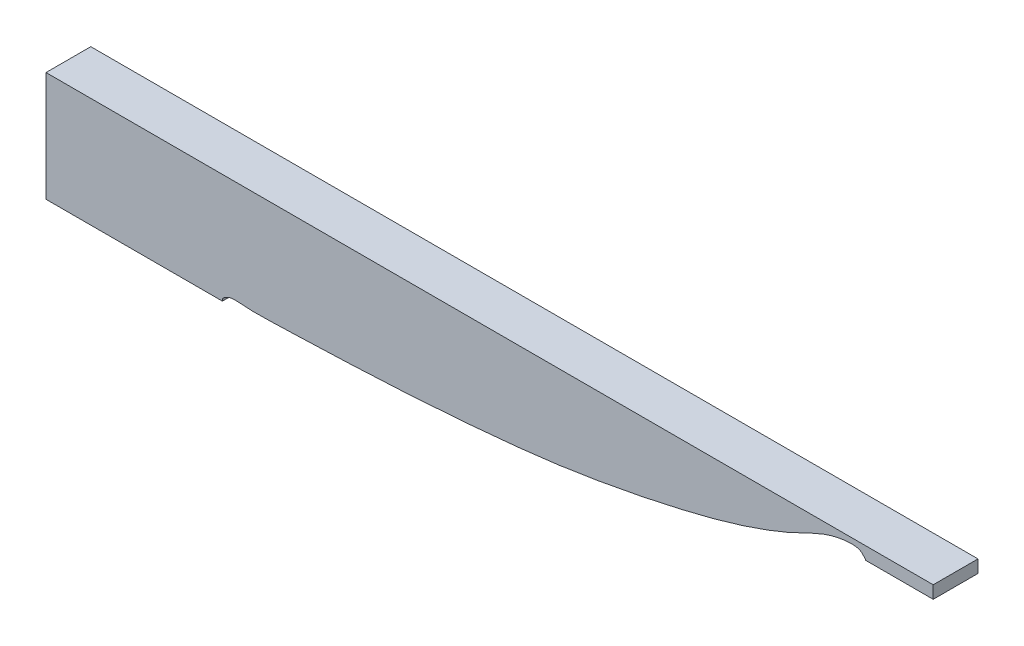
ISO-10303-21;
HEADER;
FILE_DESCRIPTION(('STEP AP214'),'2;1');
FILE_NAME('part.step','',(''),(''),'','','');
FILE_SCHEMA(('AUTOMOTIVE_DESIGN { 1 0 10303 214 1 1 1 1 }'));
ENDSEC;
DATA;
#1=APPLICATION_CONTEXT('core data for automotive mechanical design processes');
#2=APPLICATION_PROTOCOL_DEFINITION('international standard','automotive_design',2000,#1);
#3=PRODUCT_CONTEXT('',#1,'mechanical');
#4=PRODUCT('Part','Part','',(#3));
#5=PRODUCT_RELATED_PRODUCT_CATEGORY('part','',(#4));
#6=PRODUCT_DEFINITION_FORMATION('','',#4);
#7=PRODUCT_DEFINITION_CONTEXT('part definition',#1,'design');
#8=PRODUCT_DEFINITION('design','',#6,#7);
#9=PRODUCT_DEFINITION_SHAPE('','',#8);
#10=(LENGTH_UNIT() NAMED_UNIT(*) SI_UNIT(.MILLI.,.METRE.));
#11=(NAMED_UNIT(*) PLANE_ANGLE_UNIT() SI_UNIT($,.RADIAN.));
#12=(NAMED_UNIT(*) SI_UNIT($,.STERADIAN.) SOLID_ANGLE_UNIT());
#13=UNCERTAINTY_MEASURE_WITH_UNIT(LENGTH_MEASURE(1.E-05),#10,'distance_accuracy_value','');
#14=(GEOMETRIC_REPRESENTATION_CONTEXT(3) GLOBAL_UNCERTAINTY_ASSIGNED_CONTEXT((#13)) GLOBAL_UNIT_ASSIGNED_CONTEXT((#10,
#11,#12)) REPRESENTATION_CONTEXT('',''));
#15=CARTESIAN_POINT('',(0.,0.,0.));
#16=DIRECTION('',(0.,0.,1.));
#17=DIRECTION('',(1.,0.,0.));
#18=AXIS2_PLACEMENT_3D('',#15,#16,#17);
#19=CARTESIAN_POINT('',(-57.0856444779674,-17.3584070864247,420.));
#20=CARTESIAN_POINT('',(-57.0958938511895,-17.2812807740695,420.));
#21=CARTESIAN_POINT('',(-57.1046449984719,-17.2036665476292,420.));
#22=CARTESIAN_POINT('',(-57.0899645176034,-17.0492737578739,420.));
#23=CARTESIAN_POINT('',(-57.0668828076527,-16.9734881157553,420.));
#24=CARTESIAN_POINT('',(-56.9878355157819,-16.8378223846223,420.));
#25=CARTESIAN_POINT('',(-56.9316112455652,-16.7831693763308,420.));
#26=CARTESIAN_POINT('',(-56.8080894899606,-16.6877198817174,420.));
#27=CARTESIAN_POINT('',(-56.7437683030261,-16.6434958151046,420.));
#28=CARTESIAN_POINT('',(-56.5516796164489,-16.5096274099825,420.));
#29=CARTESIAN_POINT('',(-56.4199949598256,-16.4264797119411,420.));
#30=CARTESIAN_POINT('',(-56.1448046291808,-16.2807479394498,420.));
#31=CARTESIAN_POINT('',(-55.9995997977835,-16.2206800897899,420.));
#32=CARTESIAN_POINT('',(-55.5579023322916,-16.091901408502,420.));
#33=CARTESIAN_POINT('',(-55.2501587200471,-16.0631446233928,420.));
#34=CARTESIAN_POINT('',(-54.6320985145757,-16.0495812138025,420.));
#35=CARTESIAN_POINT('',(-54.3239983710323,-16.063703374076,420.));
#36=CARTESIAN_POINT('',(-53.7084182226755,-16.1058873346026,420.));
#37=CARTESIAN_POINT('',(-53.4008641403254,-16.1339882003165,420.));
#38=CARTESIAN_POINT('',(-52.7855704081264,-16.177382805587,420.));
#39=CARTESIAN_POINT('',(-52.477992049539,-16.1934040094259,420.));
#40=CARTESIAN_POINT('',(-51.5554291724624,-16.2272003278678,420.));
#41=CARTESIAN_POINT('',(-50.9406291232356,-16.2296914870753,420.));
#42=CARTESIAN_POINT('',(-49.7113153436075,-16.2109512400088,420.));
#43=CARTESIAN_POINT('',(-49.0967641295459,-16.1928254925497,420.));
#44=CARTESIAN_POINT('',(-47.8676632328352,-16.1564471144936,420.));
#45=CARTESIAN_POINT('',(-47.2531077047007,-16.1386788038124,420.));
#46=CARTESIAN_POINT('',(-45.4094873855464,-16.0815406260742,420.));
#47=CARTESIAN_POINT('',(-44.1804606464768,-16.0383988732113,420.));
#48=CARTESIAN_POINT('',(-40.4934412801088,-15.9086189602691,420.));
#49=CARTESIAN_POINT('',(-38.0355300402966,-15.8189897272557,420.));
#50=CARTESIAN_POINT('',(-33.120300515922,-15.6248458989966,420.));
#51=CARTESIAN_POINT('',(-30.6630116675852,-15.5173604476547,420.));
#52=CARTESIAN_POINT('',(-25.7509362005327,-15.2649205038111,420.));
#53=CARTESIAN_POINT('',(-23.2961058982495,-15.1199275619522,420.));
#54=CARTESIAN_POINT('',(-18.3891450502226,-14.7879662459706,420.));
#55=CARTESIAN_POINT('',(-15.9369298305191,-14.602314370581,420.));
#56=CARTESIAN_POINT('',(-11.0346522059931,-14.1975389589726,420.));
#57=CARTESIAN_POINT('',(-8.58494258066309,-13.9796971209189,420.));
#58=CARTESIAN_POINT('',(-3.69151938891769,-13.4933574943147,420.));
#59=CARTESIAN_POINT('',(-1.24779688227064,-13.2236687991472,420.));
#60=CARTESIAN_POINT('',(3.6300234731844,-12.5989024675774,420.));
#61=CARTESIAN_POINT('',(6.0648283105922,-12.2422988816133,420.));
#62=CARTESIAN_POINT('',(10.9197419074105,-11.4429748096449,420.));
#63=CARTESIAN_POINT('',(13.3400043757498,-11.002235927512,420.));
#64=CARTESIAN_POINT('',(18.1699527866466,-10.0608096695689,420.));
#65=CARTESIAN_POINT('',(20.5782748669358,-9.55899324798193,420.));
#66=CARTESIAN_POINT('',(25.3786228586416,-8.47916452803047,420.));
#67=CARTESIAN_POINT('',(27.7713741101703,-7.90431392556251,420.));
#68=CARTESIAN_POINT('',(31.332523574618,-6.9578710546056,420.));
#69=CARTESIAN_POINT('',(32.5149972874331,-6.627653657545,420.));
#70=CARTESIAN_POINT('',(34.8679155496699,-5.92848135555881,420.));
#71=CARTESIAN_POINT('',(36.0381624199744,-5.55888986468718,420.));
#72=CARTESIAN_POINT('',(38.3663816823761,-4.78017938792675,420.));
#73=CARTESIAN_POINT('',(39.5246614401862,-4.37205021166372,420.));
#74=CARTESIAN_POINT('',(41.8253177295228,-3.50457870880546,420.));
#75=CARTESIAN_POINT('',(42.9684388269928,-3.04457568465993,420.));
#76=CARTESIAN_POINT('',(44.6616426983345,-2.29650040891828,420.));
#77=CARTESIAN_POINT('',(45.2221946304159,-2.03757586017944,420.));
#78=CARTESIAN_POINT('',(46.3391022117933,-1.5092984898531,420.));
#79=CARTESIAN_POINT('',(46.8949049029899,-1.23857150016736,420.));
#80=CARTESIAN_POINT('',(48.5649860938904,-0.433033552588563,420.));
#81=CARTESIAN_POINT('',(49.6832532873829,0.0918650163485286,420.));
#82=CARTESIAN_POINT('',(51.4372284369122,0.688916278049471,420.));
#83=CARTESIAN_POINT('',(52.0353604842366,0.854449671930844,420.));
#84=CARTESIAN_POINT('',(52.9538107497272,1.04993547585779,420.));
#85=CARTESIAN_POINT('',(53.2643885021679,1.1067063546377,420.));
#86=CARTESIAN_POINT('',(53.8859236690231,1.20015963243951,420.));
#87=CARTESIAN_POINT('',(54.1973152604482,1.2366869823558,420.));
#88=CARTESIAN_POINT('',(54.8214947366659,1.28691953949747,420.));
#89=CARTESIAN_POINT('',(55.1342449647782,1.30124023781418,420.));
#90=CARTESIAN_POINT('',(55.6055050500895,1.28782932508196,420.));
#91=CARTESIAN_POINT('',(55.7629417194518,1.27763875985676,420.));
#92=CARTESIAN_POINT('',(56.0786499595446,1.2436113294242,420.));
#93=CARTESIAN_POINT('',(56.2351864124384,1.21937160701378,420.));
#94=CARTESIAN_POINT('',(56.5417182706391,1.14511493952684,420.));
#95=CARTESIAN_POINT('',(56.6941753963643,1.09361862704683,420.));
#96=CARTESIAN_POINT('',(56.9754219988949,0.947737573456112,420.));
#97=CARTESIAN_POINT('',(57.1003287389096,0.851296687484915,420.));
#98=CARTESIAN_POINT('',(57.3318178126711,0.631893861296292,420.));
#99=CARTESIAN_POINT('',(57.4351452052687,0.511001626209628,420.));
#100=CARTESIAN_POINT('',(57.5957624664121,0.334733802734946,420.));
#101=CARTESIAN_POINT('',(57.6495778388689,0.276226860924751,420.));
#102=CARTESIAN_POINT('',(57.7457152479352,0.14885472804569,420.));
#103=CARTESIAN_POINT('',(57.7854178586045,0.0787515489840809,420.));
#104=CARTESIAN_POINT('',(57.8020920778847,0.,420.));
#105=B_SPLINE_CURVE_WITH_KNOTS('',3,(#19,#20,#21,#22,#23,#24,#25,#26,#27,#28,#29,#30,#31,#32,
#33,#34,#35,#36,#37,#38,#39,#40,#41,#42,#43,#44,#45,#46,#47,#48,#49,#50,#51,#52,#53,#54,#55,#56,
#57,#58,#59,#60,#61,#62,#63,#64,#65,#66,#67,#68,#69,#70,#71,#72,#73,#74,#75,#76,#77,#78,#79,#80,
#81,#82,#83,#84,#85,#86,#87,#88,#89,#90,#91,#92,#93,#94,#95,#96,#97,#98,#99,#100,#101,#102,#103,
#104),.UNSPECIFIED.,.F.,.F.,(4,2,2,2,2,2,2,2,2,2,2,2,2,2,2,2,2,2,2,2,2,2,2,2,2,2,2,2,2,2,2,2,2,
2,2,2,2,2,2,2,2,2,4),(0.,0.00195312499999989,0.00390624999999978,0.00585937499999978,
0.00781249999999967,0.0117187499999996,0.0156249999999996,0.0234374999999994,0.0312499999999993,
0.0390624999999992,0.0468749999999991,0.062499999999999,0.0781249999999989,0.0937499999999988,
0.124999999999999,0.187499999999999,0.249999999999999,0.312499999999999,0.374999999999999,
0.437499999999999,0.499999999999999,0.562499999999999,0.625,0.6875,0.75,0.78125,0.8125,0.84375,
0.875,0.890625,0.90625,0.9375,0.953125,0.9609375,0.96875,0.9765625,0.98046875,0.984375,
0.98828125,0.9921875,0.99609375,0.998046875,1.),.UNSPECIFIED.);
#106=DIRECTION('',(0.,0.,-1.));
#107=VECTOR('',#106,1.);
#108=SURFACE_OF_LINEAR_EXTRUSION('',#105,#107);
#109=CARTESIAN_POINT('',(-57.0856444779674,-17.3584070864247,412.));
#110=CARTESIAN_POINT('',(-57.0958938511895,-17.2812807740695,412.));
#111=CARTESIAN_POINT('',(-57.1046449984719,-17.2036665476292,412.));
#112=CARTESIAN_POINT('',(-57.0899645176034,-17.0492737578739,412.));
#113=CARTESIAN_POINT('',(-57.0668828076527,-16.9734881157553,412.));
#114=CARTESIAN_POINT('',(-56.9878355157819,-16.8378223846223,412.));
#115=CARTESIAN_POINT('',(-56.9316112455652,-16.7831693763308,412.));
#116=CARTESIAN_POINT('',(-56.8080894899606,-16.6877198817174,412.));
#117=CARTESIAN_POINT('',(-56.7437683030261,-16.6434958151046,412.));
#118=CARTESIAN_POINT('',(-56.5516796164489,-16.5096274099825,412.));
#119=CARTESIAN_POINT('',(-56.4199949598256,-16.4264797119411,412.));
#120=CARTESIAN_POINT('',(-56.1448046291808,-16.2807479394498,412.));
#121=CARTESIAN_POINT('',(-55.9995997977835,-16.2206800897899,412.));
#122=CARTESIAN_POINT('',(-55.5579023322916,-16.091901408502,412.));
#123=CARTESIAN_POINT('',(-55.2501587200471,-16.0631446233928,412.));
#124=CARTESIAN_POINT('',(-54.6320985145757,-16.0495812138025,412.));
#125=CARTESIAN_POINT('',(-54.3239983710323,-16.063703374076,412.));
#126=CARTESIAN_POINT('',(-53.7084182226755,-16.1058873346026,412.));
#127=CARTESIAN_POINT('',(-53.4008641403254,-16.1339882003165,412.));
#128=CARTESIAN_POINT('',(-52.7855704081264,-16.177382805587,412.));
#129=CARTESIAN_POINT('',(-52.477992049539,-16.1934040094259,412.));
#130=CARTESIAN_POINT('',(-51.5554291724624,-16.2272003278678,412.));
#131=CARTESIAN_POINT('',(-50.9406291232356,-16.2296914870753,412.));
#132=CARTESIAN_POINT('',(-49.7113153436075,-16.2109512400088,412.));
#133=CARTESIAN_POINT('',(-49.0967641295459,-16.1928254925497,412.));
#134=CARTESIAN_POINT('',(-47.8676632328352,-16.1564471144936,412.));
#135=CARTESIAN_POINT('',(-47.2531077047007,-16.1386788038124,412.));
#136=CARTESIAN_POINT('',(-45.4094873855464,-16.0815406260742,412.));
#137=CARTESIAN_POINT('',(-44.1804606464768,-16.0383988732113,412.));
#138=CARTESIAN_POINT('',(-40.4934412801088,-15.9086189602691,412.));
#139=CARTESIAN_POINT('',(-38.0355300402966,-15.8189897272557,412.));
#140=CARTESIAN_POINT('',(-33.120300515922,-15.6248458989966,412.));
#141=CARTESIAN_POINT('',(-30.6630116675852,-15.5173604476547,412.));
#142=CARTESIAN_POINT('',(-25.7509362005327,-15.2649205038111,412.));
#143=CARTESIAN_POINT('',(-23.2961058982495,-15.1199275619522,412.));
#144=CARTESIAN_POINT('',(-18.3891450502226,-14.7879662459706,412.));
#145=CARTESIAN_POINT('',(-15.9369298305191,-14.602314370581,412.));
#146=CARTESIAN_POINT('',(-11.0346522059931,-14.1975389589726,412.));
#147=CARTESIAN_POINT('',(-8.58494258066309,-13.9796971209189,412.));
#148=CARTESIAN_POINT('',(-3.69151938891769,-13.4933574943147,412.));
#149=CARTESIAN_POINT('',(-1.24779688227064,-13.2236687991472,412.));
#150=CARTESIAN_POINT('',(3.6300234731844,-12.5989024675774,412.));
#151=CARTESIAN_POINT('',(6.0648283105922,-12.2422988816133,412.));
#152=CARTESIAN_POINT('',(10.9197419074105,-11.4429748096449,412.));
#153=CARTESIAN_POINT('',(13.3400043757498,-11.002235927512,412.));
#154=CARTESIAN_POINT('',(18.1699527866466,-10.0608096695689,412.));
#155=CARTESIAN_POINT('',(20.5782748669358,-9.55899324798193,412.));
#156=CARTESIAN_POINT('',(25.3786228586416,-8.47916452803047,412.));
#157=CARTESIAN_POINT('',(27.7713741101703,-7.90431392556251,412.));
#158=CARTESIAN_POINT('',(31.332523574618,-6.9578710546056,412.));
#159=CARTESIAN_POINT('',(32.5149972874331,-6.627653657545,412.));
#160=CARTESIAN_POINT('',(34.8679155496699,-5.92848135555881,412.));
#161=CARTESIAN_POINT('',(36.0381624199744,-5.55888986468718,412.));
#162=CARTESIAN_POINT('',(38.3663816823761,-4.78017938792675,412.));
#163=CARTESIAN_POINT('',(39.5246614401862,-4.37205021166372,412.));
#164=CARTESIAN_POINT('',(41.8253177295228,-3.50457870880546,412.));
#165=CARTESIAN_POINT('',(42.9684388269928,-3.04457568465993,412.));
#166=CARTESIAN_POINT('',(44.6616426983345,-2.29650040891828,412.));
#167=CARTESIAN_POINT('',(45.2221946304159,-2.03757586017944,412.));
#168=CARTESIAN_POINT('',(46.3391022117933,-1.5092984898531,412.));
#169=CARTESIAN_POINT('',(46.8949049029899,-1.23857150016736,412.));
#170=CARTESIAN_POINT('',(48.5649860938904,-0.433033552588563,412.));
#171=CARTESIAN_POINT('',(49.6832532873829,0.0918650163485286,412.));
#172=CARTESIAN_POINT('',(51.4372284369122,0.688916278049471,412.));
#173=CARTESIAN_POINT('',(52.0353604842366,0.854449671930844,412.));
#174=CARTESIAN_POINT('',(52.9538107497272,1.04993547585779,412.));
#175=CARTESIAN_POINT('',(53.2643885021679,1.1067063546377,412.));
#176=CARTESIAN_POINT('',(53.8859236690231,1.20015963243951,412.));
#177=CARTESIAN_POINT('',(54.1973152604482,1.2366869823558,412.));
#178=CARTESIAN_POINT('',(54.8214947366659,1.28691953949747,412.));
#179=CARTESIAN_POINT('',(55.1342449647782,1.30124023781418,412.));
#180=CARTESIAN_POINT('',(55.6055050500895,1.28782932508196,412.));
#181=CARTESIAN_POINT('',(55.7629417194518,1.27763875985676,412.));
#182=CARTESIAN_POINT('',(56.0786499595446,1.2436113294242,412.));
#183=CARTESIAN_POINT('',(56.2351864124384,1.21937160701378,412.));
#184=CARTESIAN_POINT('',(56.5417182706391,1.14511493952684,412.));
#185=CARTESIAN_POINT('',(56.6941753963643,1.09361862704683,412.));
#186=CARTESIAN_POINT('',(56.9754219988949,0.947737573456112,412.));
#187=CARTESIAN_POINT('',(57.1003287389096,0.851296687484915,412.));
#188=CARTESIAN_POINT('',(57.3318178126711,0.631893861296292,412.));
#189=CARTESIAN_POINT('',(57.4351452052687,0.511001626209628,412.));
#190=CARTESIAN_POINT('',(57.5957624664121,0.334733802734946,412.));
#191=CARTESIAN_POINT('',(57.6495778388689,0.276226860924751,412.));
#192=CARTESIAN_POINT('',(57.7457152479352,0.14885472804569,412.));
#193=CARTESIAN_POINT('',(57.7854178586045,0.0787515489840809,412.));
#194=CARTESIAN_POINT('',(57.8020920778847,0.,412.));
#195=B_SPLINE_CURVE_WITH_KNOTS('',3,(#109,#110,#111,#112,#113,#114,#115,#116,#117,#118,#119,
#120,#121,#122,#123,#124,#125,#126,#127,#128,#129,#130,#131,#132,#133,#134,#135,#136,#137,#138,
#139,#140,#141,#142,#143,#144,#145,#146,#147,#148,#149,#150,#151,#152,#153,#154,#155,#156,#157,
#158,#159,#160,#161,#162,#163,#164,#165,#166,#167,#168,#169,#170,#171,#172,#173,#174,#175,#176,
#177,#178,#179,#180,#181,#182,#183,#184,#185,#186,#187,#188,#189,#190,#191,#192,#193,#194),
.UNSPECIFIED.,.F.,.F.,(4,2,2,2,2,2,2,2,2,2,2,2,2,2,2,2,2,2,2,2,2,2,2,2,2,2,2,2,2,2,2,2,2,2,2,2,
2,2,2,2,2,2,4),(0.,0.00195312499999989,0.00390624999999978,0.00585937499999978,
0.00781249999999967,0.0117187499999996,0.0156249999999996,0.0234374999999994,0.0312499999999993,
0.0390624999999992,0.0468749999999991,0.062499999999999,0.0781249999999989,0.0937499999999988,
0.124999999999999,0.187499999999999,0.249999999999999,0.312499999999999,0.374999999999999,
0.437499999999999,0.499999999999999,0.562499999999999,0.625,0.6875,0.75,0.78125,0.8125,0.84375,
0.875,0.890625,0.90625,0.9375,0.953125,0.9609375,0.96875,0.9765625,0.98046875,0.984375,
0.98828125,0.9921875,0.99609375,0.998046875,1.),.UNSPECIFIED.);
#196=CARTESIAN_POINT('',(-57.0856444779674,-17.3584070864247,412.));
#197=VERTEX_POINT('',#196);
#198=CARTESIAN_POINT('',(57.8020920778847,0.,412.));
#199=VERTEX_POINT('',#198);
#200=EDGE_CURVE('E165',#197,#199,#195,.T.);
#201=ORIENTED_EDGE('',*,*,#200,.T.);
#202=DIRECTION('',(0.,0.,-1.));
#203=VECTOR('',#202,1.);
#204=CARTESIAN_POINT('',(57.8020920778847,0.,420.));
#205=LINE('',#204,#203);
#206=CARTESIAN_POINT('',(57.8020920778847,0.,420.));
#207=VERTEX_POINT('',#206);
#208=EDGE_CURVE('E11',#207,#199,#205,.T.);
#209=ORIENTED_EDGE('',*,*,#208,.F.);
#210=CARTESIAN_POINT('',(57.8020920778847,0.,420.));
#211=CARTESIAN_POINT('',(57.7854178586045,0.0787515489840809,420.));
#212=CARTESIAN_POINT('',(57.7457152479352,0.14885472804569,420.));
#213=CARTESIAN_POINT('',(57.6495778388689,0.276226860924751,420.));
#214=CARTESIAN_POINT('',(57.5957624664121,0.334733802734946,420.));
#215=CARTESIAN_POINT('',(57.4351452052687,0.511001626209628,420.));
#216=CARTESIAN_POINT('',(57.3318178126711,0.631893861296292,420.));
#217=CARTESIAN_POINT('',(57.1003287389096,0.851296687484915,420.));
#218=CARTESIAN_POINT('',(56.9754219988949,0.947737573456112,420.));
#219=CARTESIAN_POINT('',(56.6941753963643,1.09361862704683,420.));
#220=CARTESIAN_POINT('',(56.5417182706391,1.14511493952684,420.));
#221=CARTESIAN_POINT('',(56.2351864124384,1.21937160701378,420.));
#222=CARTESIAN_POINT('',(56.0786499595446,1.2436113294242,420.));
#223=CARTESIAN_POINT('',(55.7629417194518,1.27763875985676,420.));
#224=CARTESIAN_POINT('',(55.6055050500895,1.28782932508196,420.));
#225=CARTESIAN_POINT('',(55.1342449647782,1.30124023781418,420.));
#226=CARTESIAN_POINT('',(54.8214947366659,1.28691953949747,420.));
#227=CARTESIAN_POINT('',(54.1973152604482,1.2366869823558,420.));
#228=CARTESIAN_POINT('',(53.8859236690231,1.20015963243951,420.));
#229=CARTESIAN_POINT('',(53.2643885021679,1.1067063546377,420.));
#230=CARTESIAN_POINT('',(52.9538107497272,1.04993547585779,420.));
#231=CARTESIAN_POINT('',(52.0353604842366,0.854449671930844,420.));
#232=CARTESIAN_POINT('',(51.4372284369122,0.688916278049471,420.));
#233=CARTESIAN_POINT('',(49.6832532873829,0.0918650163485286,420.));
#234=CARTESIAN_POINT('',(48.5649860938904,-0.433033552588563,420.));
#235=CARTESIAN_POINT('',(46.8949049029899,-1.23857150016736,420.));
#236=CARTESIAN_POINT('',(46.3391022117933,-1.5092984898531,420.));
#237=CARTESIAN_POINT('',(45.2221946304159,-2.03757586017944,420.));
#238=CARTESIAN_POINT('',(44.6616426983345,-2.29650040891828,420.));
#239=CARTESIAN_POINT('',(42.9684388269928,-3.04457568465993,420.));
#240=CARTESIAN_POINT('',(41.8253177295228,-3.50457870880546,420.));
#241=CARTESIAN_POINT('',(39.5246614401862,-4.37205021166372,420.));
#242=CARTESIAN_POINT('',(38.3663816823761,-4.78017938792675,420.));
#243=CARTESIAN_POINT('',(36.0381624199744,-5.55888986468718,420.));
#244=CARTESIAN_POINT('',(34.8679155496699,-5.92848135555881,420.));
#245=CARTESIAN_POINT('',(32.5149972874331,-6.627653657545,420.));
#246=CARTESIAN_POINT('',(31.332523574618,-6.9578710546056,420.));
#247=CARTESIAN_POINT('',(27.7713741101703,-7.90431392556251,420.));
#248=CARTESIAN_POINT('',(25.3786228586416,-8.47916452803047,420.));
#249=CARTESIAN_POINT('',(20.5782748669358,-9.55899324798193,420.));
#250=CARTESIAN_POINT('',(18.1699527866466,-10.0608096695689,420.));
#251=CARTESIAN_POINT('',(13.3400043757498,-11.002235927512,420.));
#252=CARTESIAN_POINT('',(10.9197419074105,-11.4429748096449,420.));
#253=CARTESIAN_POINT('',(6.0648283105922,-12.2422988816133,420.));
#254=CARTESIAN_POINT('',(3.6300234731844,-12.5989024675774,420.));
#255=CARTESIAN_POINT('',(-1.24779688227064,-13.2236687991472,420.));
#256=CARTESIAN_POINT('',(-3.69151938891769,-13.4933574943147,420.));
#257=CARTESIAN_POINT('',(-8.58494258066309,-13.9796971209189,420.));
#258=CARTESIAN_POINT('',(-11.0346522059931,-14.1975389589726,420.));
#259=CARTESIAN_POINT('',(-15.9369298305191,-14.602314370581,420.));
#260=CARTESIAN_POINT('',(-18.3891450502226,-14.7879662459706,420.));
#261=CARTESIAN_POINT('',(-23.2961058982495,-15.1199275619522,420.));
#262=CARTESIAN_POINT('',(-25.7509362005327,-15.2649205038111,420.));
#263=CARTESIAN_POINT('',(-30.6630116675852,-15.5173604476547,420.));
#264=CARTESIAN_POINT('',(-33.120300515922,-15.6248458989966,420.));
#265=CARTESIAN_POINT('',(-38.0355300402966,-15.8189897272557,420.));
#266=CARTESIAN_POINT('',(-40.4934412801088,-15.9086189602691,420.));
#267=CARTESIAN_POINT('',(-44.1804606464768,-16.0383988732113,420.));
#268=CARTESIAN_POINT('',(-45.4094873855464,-16.0815406260742,420.));
#269=CARTESIAN_POINT('',(-47.2531077047007,-16.1386788038124,420.));
#270=CARTESIAN_POINT('',(-47.8676632328352,-16.1564471144936,420.));
#271=CARTESIAN_POINT('',(-49.0967641295459,-16.1928254925497,420.));
#272=CARTESIAN_POINT('',(-49.7113153436075,-16.2109512400088,420.));
#273=CARTESIAN_POINT('',(-50.9406291232356,-16.2296914870753,420.));
#274=CARTESIAN_POINT('',(-51.5554291724624,-16.2272003278678,420.));
#275=CARTESIAN_POINT('',(-52.477992049539,-16.1934040094259,420.));
#276=CARTESIAN_POINT('',(-52.7855704081264,-16.177382805587,420.));
#277=CARTESIAN_POINT('',(-53.4008641403254,-16.1339882003165,420.));
#278=CARTESIAN_POINT('',(-53.7084182226755,-16.1058873346026,420.));
#279=CARTESIAN_POINT('',(-54.3239983710323,-16.063703374076,420.));
#280=CARTESIAN_POINT('',(-54.6320985145757,-16.0495812138025,420.));
#281=CARTESIAN_POINT('',(-55.2501587200471,-16.0631446233928,420.));
#282=CARTESIAN_POINT('',(-55.5579023322916,-16.091901408502,420.));
#283=CARTESIAN_POINT('',(-55.9995997977835,-16.2206800897899,420.));
#284=CARTESIAN_POINT('',(-56.1448046291808,-16.2807479394498,420.));
#285=CARTESIAN_POINT('',(-56.4199949598256,-16.4264797119411,420.));
#286=CARTESIAN_POINT('',(-56.5516796164489,-16.5096274099825,420.));
#287=CARTESIAN_POINT('',(-56.7437683030261,-16.6434958151046,420.));
#288=CARTESIAN_POINT('',(-56.8080894899606,-16.6877198817174,420.));
#289=CARTESIAN_POINT('',(-56.9316112455652,-16.7831693763308,420.));
#290=CARTESIAN_POINT('',(-56.9878355157819,-16.8378223846223,420.));
#291=CARTESIAN_POINT('',(-57.0668828076527,-16.9734881157553,420.));
#292=CARTESIAN_POINT('',(-57.0899645176034,-17.0492737578739,420.));
#293=CARTESIAN_POINT('',(-57.1046449984719,-17.2036665476292,420.));
#294=CARTESIAN_POINT('',(-57.0958938511895,-17.2812807740695,420.));
#295=CARTESIAN_POINT('',(-57.0856444779674,-17.3584070864247,420.));
#296=B_SPLINE_CURVE_WITH_KNOTS('',3,(#210,#211,#212,#213,#214,#215,#216,#217,#218,#219,#220,
#221,#222,#223,#224,#225,#226,#227,#228,#229,#230,#231,#232,#233,#234,#235,#236,#237,#238,#239,
#240,#241,#242,#243,#244,#245,#246,#247,#248,#249,#250,#251,#252,#253,#254,#255,#256,#257,#258,
#259,#260,#261,#262,#263,#264,#265,#266,#267,#268,#269,#270,#271,#272,#273,#274,#275,#276,#277,
#278,#279,#280,#281,#282,#283,#284,#285,#286,#287,#288,#289,#290,#291,#292,#293,#294,#295),
.UNSPECIFIED.,.F.,.F.,(4,2,2,2,2,2,2,2,2,2,2,2,2,2,2,2,2,2,2,2,2,2,2,2,2,2,2,2,2,2,2,2,2,2,2,2,
2,2,2,2,2,2,4),(0.,0.001953125,0.00390625,0.00781250000000011,0.0117187500000001,
0.0156250000000002,0.0195312500000002,0.0234375000000003,0.0312500000000002,0.0390625000000002,
0.0468750000000001,0.0625000000000002,0.0937500000000003,0.109375,0.125,0.15625,0.1875,0.21875,
0.25,0.3125,0.375,0.437500000000001,0.500000000000001,0.562500000000001,0.625000000000001,
0.687500000000001,0.750000000000001,0.812500000000001,0.875000000000001,0.906250000000001,
0.921875000000001,0.937500000000001,0.953125000000001,0.960937500000001,0.968750000000001,
0.976562500000001,0.984375,0.98828125,0.9921875,0.994140625,0.99609375,0.998046875,1.),.UNSPECIFIED.);
#297=CARTESIAN_POINT('',(-57.0856444779674,-17.3584070864247,420.));
#298=VERTEX_POINT('',#297);
#299=EDGE_CURVE('E129',#298,#207,#296,.F.);
#300=ORIENTED_EDGE('',*,*,#299,.F.);
#301=DIRECTION('',(0.,0.,-1.));
#302=VECTOR('',#301,1.);
#303=CARTESIAN_POINT('',(-57.0856444779674,-17.3584070864247,420.));
#304=LINE('',#303,#302);
#305=EDGE_CURVE('E114',#298,#197,#304,.T.);
#306=ORIENTED_EDGE('',*,*,#305,.T.);
#307=EDGE_LOOP('',(#201,#209,#300,#306));
#308=FACE_BOUND('',#307,.T.);
#309=ADVANCED_FACE('F30',(#308),#108,.F.);
#310=CARTESIAN_POINT('',(57.8020920778847,0.,420.));
#311=DIRECTION('',(0.,1.,0.));
#312=DIRECTION('',(-1.,0.,0.));
#313=AXIS2_PLACEMENT_3D('',#310,#311,#312);
#314=PLANE('',#313);
#315=DIRECTION('',(1.,0.,0.));
#316=VECTOR('',#315,1.);
#317=CARTESIAN_POINT('',(57.8020920778847,0.,412.));
#318=LINE('',#317,#316);
#319=CARTESIAN_POINT('',(69.8852934003311,0.,412.));
#320=VERTEX_POINT('',#319);
#321=EDGE_CURVE('E120',#199,#320,#318,.T.);
#322=ORIENTED_EDGE('',*,*,#321,.T.);
#323=DIRECTION('',(0.,0.,-1.));
#324=VECTOR('',#323,1.);
#325=CARTESIAN_POINT('',(69.8852934003311,0.,420.));
#326=LINE('',#325,#324);
#327=CARTESIAN_POINT('',(69.8852934003311,0.,420.));
#328=VERTEX_POINT('',#327);
#329=EDGE_CURVE('E41',#328,#320,#326,.T.);
#330=ORIENTED_EDGE('',*,*,#329,.F.);
#331=DIRECTION('',(1.,0.,0.));
#332=VECTOR('',#331,1.);
#333=CARTESIAN_POINT('',(57.8020920778847,0.,420.));
#334=LINE('',#333,#332);
#335=EDGE_CURVE('E87',#207,#328,#334,.T.);
#336=ORIENTED_EDGE('',*,*,#335,.F.);
#337=ORIENTED_EDGE('',*,*,#208,.T.);
#338=EDGE_LOOP('',(#322,#330,#336,#337));
#339=FACE_BOUND('',#338,.T.);
#340=ADVANCED_FACE('F199',(#339),#314,.F.);
#341=CARTESIAN_POINT('',(69.8852934003311,2.25600000000005,420.));
#342=DIRECTION('',(-1.,0.,0.));
#343=DIRECTION('',(0.,0.,1.));
#344=AXIS2_PLACEMENT_3D('',#341,#342,#343);
#345=PLANE('',#344);
#346=DIRECTION('',(0.,1.,0.));
#347=VECTOR('',#346,1.);
#348=CARTESIAN_POINT('',(69.8852934003311,2.25600000000005,412.));
#349=LINE('',#348,#347);
#350=CARTESIAN_POINT('',(69.8852934003311,2.25600000000005,412.));
#351=VERTEX_POINT('',#350);
#352=EDGE_CURVE('E118',#320,#351,#349,.T.);
#353=ORIENTED_EDGE('',*,*,#352,.T.);
#354=DIRECTION('',(0.,0.,-1.));
#355=VECTOR('',#354,1.);
#356=CARTESIAN_POINT('',(69.8852934003311,2.25600000000005,420.));
#357=LINE('',#356,#355);
#358=CARTESIAN_POINT('',(69.8852934003311,2.25600000000005,420.));
#359=VERTEX_POINT('',#358);
#360=EDGE_CURVE('E109',#359,#351,#357,.T.);
#361=ORIENTED_EDGE('',*,*,#360,.F.);
#362=DIRECTION('',(0.,1.,0.));
#363=VECTOR('',#362,1.);
#364=CARTESIAN_POINT('',(69.8852934003311,2.25600000000005,420.));
#365=LINE('',#364,#363);
#366=EDGE_CURVE('E100',#328,#359,#365,.T.);
#367=ORIENTED_EDGE('',*,*,#366,.F.);
#368=ORIENTED_EDGE('',*,*,#329,.T.);
#369=EDGE_LOOP('',(#353,#361,#367,#368));
#370=FACE_BOUND('',#369,.T.);
#371=ADVANCED_FACE('F202',(#370),#345,.F.);
#372=CARTESIAN_POINT('',(69.8852934003311,2.25600000000005,420.));
#373=DIRECTION('',(0.,-1.,0.));
#374=DIRECTION('',(1.,0.,0.));
#375=AXIS2_PLACEMENT_3D('',#372,#373,#374);
#376=PLANE('',#375);
#377=DIRECTION('',(-1.,0.,0.));
#378=VECTOR('',#377,1.);
#379=CARTESIAN_POINT('',(69.8852934003311,2.25600000000005,412.));
#380=LINE('',#379,#378);
#381=CARTESIAN_POINT('',(-88.6009177949581,2.25600000000003,412.));
#382=VERTEX_POINT('',#381);
#383=EDGE_CURVE('E108',#351,#382,#380,.T.);
#384=ORIENTED_EDGE('',*,*,#383,.T.);
#385=DIRECTION('',(0.,0.,-1.));
#386=VECTOR('',#385,1.);
#387=CARTESIAN_POINT('',(-88.6009177949581,2.25600000000003,420.));
#388=LINE('',#387,#386);
#389=CARTESIAN_POINT('',(-88.6009177949581,2.25600000000003,420.));
#390=VERTEX_POINT('',#389);
#391=EDGE_CURVE('E105',#390,#382,#388,.T.);
#392=ORIENTED_EDGE('',*,*,#391,.F.);
#393=DIRECTION('',(-1.,0.,0.));
#394=VECTOR('',#393,1.);
#395=CARTESIAN_POINT('',(69.8852934003311,2.25600000000005,420.));
#396=LINE('',#395,#394);
#397=EDGE_CURVE('E94',#359,#390,#396,.T.);
#398=ORIENTED_EDGE('',*,*,#397,.F.);
#399=ORIENTED_EDGE('',*,*,#360,.T.);
#400=EDGE_LOOP('',(#384,#392,#398,#399));
#401=FACE_BOUND('',#400,.T.);
#402=ADVANCED_FACE('F106',(#401),#376,.F.);
#403=CARTESIAN_POINT('',(-88.6009177949548,-17.3584586652259,420.));
#404=DIRECTION('',(1.,1.64146603603239E-13,0.));
#405=DIRECTION('',(-1.64146603603239E-13,1.,0.));
#406=AXIS2_PLACEMENT_3D('',#403,#404,#405);
#407=PLANE('',#406);
#408=DIRECTION('',(1.64146603603239E-13,-1.,0.));
#409=VECTOR('',#408,1.);
#410=CARTESIAN_POINT('',(-88.6009177949548,-17.3584586652259,412.));
#411=LINE('',#410,#409);
#412=CARTESIAN_POINT('',(-88.6009177949548,-17.3584586652259,412.));
#413=VERTEX_POINT('',#412);
#414=EDGE_CURVE('E73',#382,#413,#411,.T.);
#415=ORIENTED_EDGE('',*,*,#414,.T.);
#416=DIRECTION('',(0.,0.,-1.));
#417=VECTOR('',#416,1.);
#418=CARTESIAN_POINT('',(-88.6009177949548,-17.3584586652259,420.));
#419=LINE('',#418,#417);
#420=CARTESIAN_POINT('',(-88.6009177949548,-17.3584586652259,420.));
#421=VERTEX_POINT('',#420);
#422=EDGE_CURVE('E110',#421,#413,#419,.T.);
#423=ORIENTED_EDGE('',*,*,#422,.F.);
#424=DIRECTION('',(1.64146603603239E-13,-1.,0.));
#425=VECTOR('',#424,1.);
#426=CARTESIAN_POINT('',(-88.6009177949548,-17.3584586652259,420.));
#427=LINE('',#426,#425);
#428=EDGE_CURVE('E98',#390,#421,#427,.T.);
#429=ORIENTED_EDGE('',*,*,#428,.F.);
#430=ORIENTED_EDGE('',*,*,#391,.T.);
#431=EDGE_LOOP('',(#415,#423,#429,#430));
#432=FACE_BOUND('',#431,.T.);
#433=ADVANCED_FACE('F112',(#432),#407,.F.);
#434=CARTESIAN_POINT('',(-88.6009177949548,-17.3584586652259,420.));
#435=DIRECTION('',(-1.63662871213735E-06,0.999999999998661,0.));
#436=DIRECTION('',(-0.999999999998661,-1.63662871213735E-06,0.));
#437=AXIS2_PLACEMENT_3D('',#434,#435,#436);
#438=PLANE('',#437);
#439=DIRECTION('',(0.999999999998661,1.63662871213735E-06,0.));
#440=VECTOR('',#439,1.);
#441=CARTESIAN_POINT('',(-88.6009177949548,-17.3584586652259,412.));
#442=LINE('',#441,#440);
#443=EDGE_CURVE('E79',#413,#197,#442,.T.);
#444=ORIENTED_EDGE('',*,*,#443,.T.);
#445=ORIENTED_EDGE('',*,*,#305,.F.);
#446=DIRECTION('',(0.999999999998661,1.63662871213735E-06,0.));
#447=VECTOR('',#446,1.);
#448=CARTESIAN_POINT('',(-88.6009177949548,-17.3584586652259,420.));
#449=LINE('',#448,#447);
#450=EDGE_CURVE('E50',#421,#298,#449,.T.);
#451=ORIENTED_EDGE('',*,*,#450,.F.);
#452=ORIENTED_EDGE('',*,*,#422,.T.);
#453=EDGE_LOOP('',(#444,#445,#451,#452));
#454=FACE_BOUND('',#453,.T.);
#455=ADVANCED_FACE('F145',(#454),#438,.F.);
#456=CARTESIAN_POINT('',(1.19111329545695,-12.9112856333623,420.));
#457=DIRECTION('',(0.,0.,-1.));
#458=DIRECTION('',(-1.,0.,0.));
#459=AXIS2_PLACEMENT_3D('',#456,#457,#458);
#460=PLANE('',#459);
#461=ORIENTED_EDGE('',*,*,#299,.T.);
#462=ORIENTED_EDGE('',*,*,#335,.T.);
#463=ORIENTED_EDGE('',*,*,#366,.T.);
#464=ORIENTED_EDGE('',*,*,#397,.T.);
#465=ORIENTED_EDGE('',*,*,#428,.T.);
#466=ORIENTED_EDGE('',*,*,#450,.T.);
#467=EDGE_LOOP('',(#461,#462,#463,#464,#465,#466));
#468=FACE_BOUND('',#467,.T.);
#469=ADVANCED_FACE('F96',(#468),#460,.F.);
#470=CARTESIAN_POINT('',(1.19111329545695,-12.9112856333623,412.));
#471=DIRECTION('',(0.,0.,-1.));
#472=DIRECTION('',(-1.,0.,0.));
#473=AXIS2_PLACEMENT_3D('',#470,#471,#472);
#474=PLANE('',#473);
#475=ORIENTED_EDGE('',*,*,#200,.F.);
#476=ORIENTED_EDGE('',*,*,#443,.F.);
#477=ORIENTED_EDGE('',*,*,#414,.F.);
#478=ORIENTED_EDGE('',*,*,#383,.F.);
#479=ORIENTED_EDGE('',*,*,#352,.F.);
#480=ORIENTED_EDGE('',*,*,#321,.F.);
#481=EDGE_LOOP('',(#475,#476,#477,#478,#479,#480));
#482=FACE_BOUND('',#481,.T.);
#483=ADVANCED_FACE('F144',(#482),#474,.T.);
#484=CLOSED_SHELL('',(#309,#340,#371,#402,#433,#455,#469,#483));
#485=MANIFOLD_SOLID_BREP('B2',#484);
#486=ADVANCED_BREP_SHAPE_REPRESENTATION('',(#18,#485),#14);
#487=SHAPE_DEFINITION_REPRESENTATION(#9,#486);
ENDSEC;
END-ISO-10303-21;
